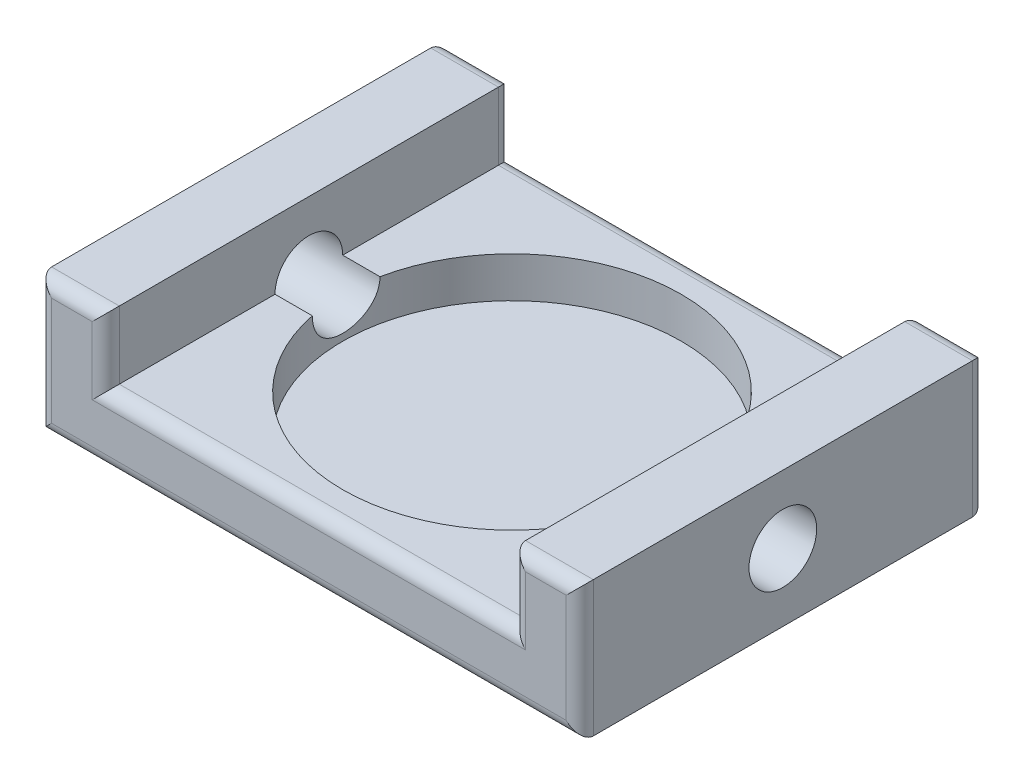
ISO-10303-21;
HEADER;
FILE_DESCRIPTION(('STEP AP214'),'2;1');
FILE_NAME('part.step','',(''),(''),'','','');
FILE_SCHEMA(('AUTOMOTIVE_DESIGN { 1 0 10303 214 1 1 1 1 }'));
ENDSEC;
DATA;
#1=APPLICATION_CONTEXT('core data for automotive mechanical design processes');
#2=APPLICATION_PROTOCOL_DEFINITION('international standard','automotive_design',2000,#1);
#3=PRODUCT_CONTEXT('',#1,'mechanical');
#4=PRODUCT('Part','Part','',(#3));
#5=PRODUCT_RELATED_PRODUCT_CATEGORY('part','',(#4));
#6=PRODUCT_DEFINITION_FORMATION('','',#4);
#7=PRODUCT_DEFINITION_CONTEXT('part definition',#1,'design');
#8=PRODUCT_DEFINITION('design','',#6,#7);
#9=PRODUCT_DEFINITION_SHAPE('','',#8);
#10=(LENGTH_UNIT() NAMED_UNIT(*) SI_UNIT(.MILLI.,.METRE.));
#11=(NAMED_UNIT(*) PLANE_ANGLE_UNIT() SI_UNIT($,.RADIAN.));
#12=(NAMED_UNIT(*) SI_UNIT($,.STERADIAN.) SOLID_ANGLE_UNIT());
#13=UNCERTAINTY_MEASURE_WITH_UNIT(LENGTH_MEASURE(1.E-05),#10,'distance_accuracy_value','');
#14=(GEOMETRIC_REPRESENTATION_CONTEXT(3) GLOBAL_UNCERTAINTY_ASSIGNED_CONTEXT((#13)) GLOBAL_UNIT_ASSIGNED_CONTEXT((#10,
#11,#12)) REPRESENTATION_CONTEXT('',''));
#15=CARTESIAN_POINT('',(0.,0.,0.));
#16=DIRECTION('',(0.,0.,1.));
#17=DIRECTION('',(1.,0.,0.));
#18=AXIS2_PLACEMENT_3D('',#15,#16,#17);
#19=CARTESIAN_POINT('',(40.,5.,-15.));
#20=DIRECTION('',(-1.,0.,0.));
#21=DIRECTION('',(0.,0.,1.));
#22=AXIS2_PLACEMENT_3D('',#19,#20,#21);
#23=CYLINDRICAL_SURFACE('',#22,2.5);
#24=CARTESIAN_POINT('',(0.,5.,-15.));
#25=DIRECTION('',(-1.,0.,0.));
#26=DIRECTION('',(0.,0.,1.));
#27=AXIS2_PLACEMENT_3D('',#24,#25,#26);
#28=CIRCLE('',#27,2.5);
#29=CARTESIAN_POINT('',(0.,5.,-12.5));
#30=VERTEX_POINT('',#29);
#31=EDGE_CURVE('E365',#30,#30,#28,.T.);
#32=ORIENTED_EDGE('',*,*,#31,.T.);
#33=EDGE_LOOP('',(#32));
#34=FACE_BOUND('',#33,.T.);
#35=DIRECTION('',(-1.,0.,0.));
#36=VECTOR('',#35,1.);
#37=CARTESIAN_POINT('',(40.,5.,-12.5));
#38=LINE('',#37,#36);
#39=CARTESIAN_POINT('',(7.75255128608412,5.,-12.5));
#40=VERTEX_POINT('',#39);
#41=CARTESIAN_POINT('',(5.,5.,-12.5));
#42=VERTEX_POINT('',#41);
#43=EDGE_CURVE('E199',#40,#42,#38,.T.);
#44=ORIENTED_EDGE('',*,*,#43,.F.);
#45=CARTESIAN_POINT('',(7.75255128608412,5.,-12.5));
#46=CARTESIAN_POINT('',(7.75255731295192,4.93043599285122,-12.4999924472726));
#47=CARTESIAN_POINT('',(7.75195874531872,4.86087615811526,-12.5029034044694));
#48=CARTESIAN_POINT('',(7.74959704713843,4.72226825002578,-12.5145037546515));
#49=CARTESIAN_POINT('',(7.74783406065433,4.65322011443287,-12.5231924328126));
#50=CARTESIAN_POINT('',(7.74319166095998,4.51622575334778,-12.5462721151779));
#51=CARTESIAN_POINT('',(7.74031394865905,4.44827801258642,-12.5606544324488));
#52=CARTESIAN_POINT('',(7.73353148594676,4.31387798941378,-12.5949939869294));
#53=CARTESIAN_POINT('',(7.72962673134275,4.24742571310859,-12.6149512468976));
#54=CARTESIAN_POINT('',(7.71653074955641,4.05099524532085,-12.6829872670659));
#55=CARTESIAN_POINT('',(7.70595386365234,3.92383495170288,-12.7392486829428));
#56=CARTESIAN_POINT('',(7.68230659339935,3.68081051437811,-12.8718702906674));
#57=CARTESIAN_POINT('',(7.66923595065316,3.56494754315514,-12.9482325656308));
#58=CARTESIAN_POINT('',(7.64186822947588,3.34610785170309,-13.1200472116145));
#59=CARTESIAN_POINT('',(7.62755780730428,3.24331128959749,-13.2157273393524));
#60=CARTESIAN_POINT('',(7.59943933013465,3.05511190630132,-13.4229739286767));
#61=CARTESIAN_POINT('',(7.58563135324545,2.96971178010718,-13.5345428471585));
#62=CARTESIAN_POINT('',(7.55992974731948,2.81802828917806,-13.7715997562859));
#63=CARTESIAN_POINT('',(7.54805382009446,2.75191772198595,-13.8972004085461));
#64=CARTESIAN_POINT('',(7.52770611149326,2.64181014363031,-14.1579970242398));
#65=CARTESIAN_POINT('',(7.51923382662374,2.59780986149927,-14.2931915649865));
#66=CARTESIAN_POINT('',(7.5067420561387,2.53373241693049,-14.5674564700269));
#67=CARTESIAN_POINT('',(7.50266543711247,2.51334803649467,-14.706452411483));
#68=CARTESIAN_POINT('',(7.49922695619612,2.49612254120034,-14.985950310204));
#69=CARTESIAN_POINT('',(7.49986474935861,2.49927970383803,-15.1264521565326));
#70=CARTESIAN_POINT('',(7.50573913894405,2.5288155036062,-15.4028555063468));
#71=CARTESIAN_POINT('',(7.51091007921787,2.55486262547944,-15.538794033247));
#72=CARTESIAN_POINT('',(7.52519563744545,2.62891294172258,-15.8043300165313));
#73=CARTESIAN_POINT('',(7.53431038436714,2.67691685411279,-15.9339272653924));
#74=CARTESIAN_POINT('',(7.55556777198974,2.79382600893242,-16.1840506782429));
#75=CARTESIAN_POINT('',(7.56772919022337,2.86286146736692,-16.3045143170306));
#76=CARTESIAN_POINT('',(7.59373870926992,3.01977567563967,-16.5322660947182));
#77=CARTESIAN_POINT('',(7.60758694982373,3.10765598709533,-16.6395531405533));
#78=CARTESIAN_POINT('',(7.6357240657876,3.30157090407736,-16.8398655163435));
#79=CARTESIAN_POINT('',(7.65001641895657,3.40789350518275,-16.9326117374893));
#80=CARTESIAN_POINT('',(7.67720734708936,3.63476189621838,-17.0990272497494));
#81=CARTESIAN_POINT('',(7.69010553536481,3.7553116129146,-17.172691256054));
#82=CARTESIAN_POINT('',(7.71305674894199,4.00763101236582,-17.2989498866117));
#83=CARTESIAN_POINT('',(7.72310201254138,4.13943005849171,-17.3514871915862));
#84=CARTESIAN_POINT('',(7.73909597343767,4.41014657813895,-17.4335177433248));
#85=CARTESIAN_POINT('',(7.74505077179283,4.54905311662029,-17.4630453187108));
#86=CARTESIAN_POINT('',(7.74992057020093,4.74089204211611,-17.4870823453049));
#87=CARTESIAN_POINT('',(7.75090600320019,4.79263534945611,-17.4919281391388));
#88=CARTESIAN_POINT('',(7.75222081533071,4.89624466034355,-17.4983829116616));
#89=CARTESIAN_POINT('',(7.75255129237939,4.94811031238945,-17.4999973072616));
#90=CARTESIAN_POINT('',(7.75255128608412,5.,-17.5));
#91=B_SPLINE_CURVE_WITH_KNOTS('',3,(#45,#46,#47,#48,#49,#50,#51,#52,#53,#54,#55,#56,#57,#58,#59,
#60,#61,#62,#63,#64,#65,#66,#67,#68,#69,#70,#71,#72,#73,#74,#75,#76,#77,#78,#79,#80,#81,#82,#83,
#84,#85,#86,#87,#88,#89,#90),.UNSPECIFIED.,.F.,.F.,(4,2,2,2,2,2,2,2,2,2,2,2,2,2,2,2,2,2,2,2,2,2,
4),(0.,0.208621275894802,0.417216745803838,0.62549517523698,0.833774454931105,1.25000691135225,
1.66628252025787,2.08778731527755,2.50935735880446,2.93459542557449,3.35977056463055,
3.77935021287091,4.19889916132035,4.61247011057754,5.02605458519858,5.44225366753897,
5.85848725240716,6.28192795775072,6.70548580970532,7.13018519486867,7.55424974394838,
7.71010621722896,7.86570120305829),.UNSPECIFIED.);
#92=CARTESIAN_POINT('',(7.75255128608412,5.,-17.5));
#93=VERTEX_POINT('',#92);
#94=EDGE_CURVE('E177',#40,#93,#91,.T.);
#95=ORIENTED_EDGE('',*,*,#94,.T.);
#96=DIRECTION('',(-1.,0.,0.));
#97=VECTOR('',#96,1.);
#98=CARTESIAN_POINT('',(40.,5.,-17.5));
#99=LINE('',#98,#97);
#100=CARTESIAN_POINT('',(5.,5.,-17.5));
#101=VERTEX_POINT('',#100);
#102=EDGE_CURVE('E182',#101,#93,#99,.F.);
#103=ORIENTED_EDGE('',*,*,#102,.F.);
#104=CARTESIAN_POINT('',(5.,5.,-15.));
#105=DIRECTION('',(-1.,0.,0.));
#106=DIRECTION('',(0.,0.,1.));
#107=AXIS2_PLACEMENT_3D('',#104,#105,#106);
#108=CIRCLE('',#107,2.5);
#109=EDGE_CURVE('E198',#101,#42,#108,.F.);
#110=ORIENTED_EDGE('',*,*,#109,.T.);
#111=EDGE_LOOP('',(#44,#95,#103,#110));
#112=FACE_BOUND('',#111,.T.);
#113=ADVANCED_FACE('F34',(#34,#112),#23,.F.);
#114=CARTESIAN_POINT('',(0.,10.,0.));
#115=DIRECTION('',(0.,1.,0.));
#116=DIRECTION('',(0.,0.,1.));
#117=AXIS2_PLACEMENT_3D('',#114,#115,#116);
#118=PLANE('',#117);
#119=DIRECTION('',(0.,0.,-1.));
#120=VECTOR('',#119,1.);
#121=CARTESIAN_POINT('',(35.,10.,0.));
#122=LINE('',#121,#120);
#123=CARTESIAN_POINT('',(35.,10.,-1.));
#124=VERTEX_POINT('',#123);
#125=CARTESIAN_POINT('',(35.,10.,-29.));
#126=VERTEX_POINT('',#125);
#127=EDGE_CURVE('E357',#124,#126,#122,.T.);
#128=ORIENTED_EDGE('',*,*,#127,.F.);
#129=DIRECTION('',(1.,0.,0.));
#130=VECTOR('',#129,1.);
#131=CARTESIAN_POINT('',(40.,10.,-1.));
#132=LINE('',#131,#130);
#133=CARTESIAN_POINT('',(40.,10.,-1.));
#134=VERTEX_POINT('',#133);
#135=EDGE_CURVE('E258',#124,#134,#132,.T.);
#136=ORIENTED_EDGE('',*,*,#135,.T.);
#137=DIRECTION('',(0.,0.,-1.));
#138=VECTOR('',#137,1.);
#139=CARTESIAN_POINT('',(40.,10.,0.));
#140=LINE('',#139,#138);
#141=CARTESIAN_POINT('',(40.,10.,-29.));
#142=VERTEX_POINT('',#141);
#143=EDGE_CURVE('E204',#134,#142,#140,.T.);
#144=ORIENTED_EDGE('',*,*,#143,.T.);
#145=DIRECTION('',(-1.,0.,0.));
#146=VECTOR('',#145,1.);
#147=CARTESIAN_POINT('',(35.,10.,-29.));
#148=LINE('',#147,#146);
#149=EDGE_CURVE('E256',#142,#126,#148,.T.);
#150=ORIENTED_EDGE('',*,*,#149,.T.);
#151=EDGE_LOOP('',(#128,#136,#144,#150));
#152=FACE_BOUND('',#151,.T.);
#153=ADVANCED_FACE('F411',(#152),#118,.T.);
#154=CARTESIAN_POINT('',(40.,5.,-15.));
#155=DIRECTION('',(-1.,0.,0.));
#156=DIRECTION('',(0.,0.,1.));
#157=AXIS2_PLACEMENT_3D('',#154,#155,#156);
#158=CIRCLE('',#157,2.5);
#159=CARTESIAN_POINT('',(40.,5.,-12.5));
#160=VERTEX_POINT('',#159);
#161=EDGE_CURVE('E370',#160,#160,#158,.T.);
#162=ORIENTED_EDGE('',*,*,#161,.F.);
#163=EDGE_LOOP('',(#162));
#164=FACE_BOUND('',#163,.T.);
#165=CARTESIAN_POINT('',(32.2474487139159,5.,-17.5));
#166=VERTEX_POINT('',#165);
#167=CARTESIAN_POINT('',(35.,5.,-17.5));
#168=VERTEX_POINT('',#167);
#169=EDGE_CURVE('E190',#166,#168,#99,.F.);
#170=ORIENTED_EDGE('',*,*,#169,.F.);
#171=CARTESIAN_POINT('',(32.2474487139159,5.,-17.5));
#172=CARTESIAN_POINT('',(32.2474426870481,4.93043599285122,-17.5000075527274));
#173=CARTESIAN_POINT('',(32.2480412546813,4.86087615811526,-17.4970965955306));
#174=CARTESIAN_POINT('',(32.2504029528616,4.72226825002578,-17.4854962453485));
#175=CARTESIAN_POINT('',(32.2521659393457,4.65322011443287,-17.4768075671874));
#176=CARTESIAN_POINT('',(32.25680833904,4.51622575334778,-17.4537278848221));
#177=CARTESIAN_POINT('',(32.259686051341,4.44827801258642,-17.4393455675512));
#178=CARTESIAN_POINT('',(32.2664685140532,4.31387798941378,-17.4050060130706));
#179=CARTESIAN_POINT('',(32.2703732686573,4.24742571310859,-17.3850487531024));
#180=CARTESIAN_POINT('',(32.2834692504436,4.05099524532085,-17.3170127329341));
#181=CARTESIAN_POINT('',(32.2940461363477,3.92383495170288,-17.2607513170572));
#182=CARTESIAN_POINT('',(32.3176934066007,3.68081051437811,-17.1281297093326));
#183=CARTESIAN_POINT('',(32.3307640493469,3.56494754315514,-17.0517674343692));
#184=CARTESIAN_POINT('',(32.3581317705241,3.34610785170309,-16.8799527883855));
#185=CARTESIAN_POINT('',(32.3724421926957,3.24331128959749,-16.7842726606476));
#186=CARTESIAN_POINT('',(32.4005606698654,3.05511190630132,-16.5770260713233));
#187=CARTESIAN_POINT('',(32.4143686467546,2.96971178010718,-16.4654571528415));
#188=CARTESIAN_POINT('',(32.4400702526805,2.81802828917806,-16.2284002437141));
#189=CARTESIAN_POINT('',(32.4519461799055,2.75191772198595,-16.1027995914539));
#190=CARTESIAN_POINT('',(32.4722938885068,2.64181014363031,-15.8420029757602));
#191=CARTESIAN_POINT('',(32.4807661733763,2.59780986149928,-15.7068084350135));
#192=CARTESIAN_POINT('',(32.4932579438613,2.53373241693049,-15.4325435299731));
#193=CARTESIAN_POINT('',(32.4973345628875,2.51334803649467,-15.293547588517));
#194=CARTESIAN_POINT('',(32.5007730438039,2.49612254120034,-15.014049689796));
#195=CARTESIAN_POINT('',(32.5001352506414,2.49927970383803,-14.8735478434674));
#196=CARTESIAN_POINT('',(32.494260861056,2.5288155036062,-14.5971444936532));
#197=CARTESIAN_POINT('',(32.4890899207821,2.55486262547944,-14.461205966753));
#198=CARTESIAN_POINT('',(32.4748043625546,2.62891294172258,-14.1956699834687));
#199=CARTESIAN_POINT('',(32.4656896156329,2.67691685411279,-14.0660727346076));
#200=CARTESIAN_POINT('',(32.4444322280103,2.79382600893242,-13.8159493217571));
#201=CARTESIAN_POINT('',(32.4322708097766,2.86286146736692,-13.6954856829694));
#202=CARTESIAN_POINT('',(32.4062612907301,3.01977567563967,-13.4677339052818));
#203=CARTESIAN_POINT('',(32.3924130501763,3.10765598709533,-13.3604468594467));
#204=CARTESIAN_POINT('',(32.3642759342124,3.30157090407735,-13.1601344836565));
#205=CARTESIAN_POINT('',(32.3499835810434,3.40789350518275,-13.0673882625107));
#206=CARTESIAN_POINT('',(32.3227926529106,3.63476189621838,-12.9009727502506));
#207=CARTESIAN_POINT('',(32.3098944646352,3.7553116129146,-12.827308743946));
#208=CARTESIAN_POINT('',(32.286943251058,4.00763101236582,-12.7010501133883));
#209=CARTESIAN_POINT('',(32.2768979874586,4.13943005849171,-12.6485128084138));
#210=CARTESIAN_POINT('',(32.2609040265623,4.41014657813895,-12.5664822566752));
#211=CARTESIAN_POINT('',(32.2549492282072,4.54905311662029,-12.5369546812892));
#212=CARTESIAN_POINT('',(32.2500794297991,4.74089204211611,-12.5129176546951));
#213=CARTESIAN_POINT('',(32.2490939967998,4.79263534945611,-12.5080718608612));
#214=CARTESIAN_POINT('',(32.2477791846693,4.89624466034355,-12.5016170883384));
#215=CARTESIAN_POINT('',(32.2474487076206,4.94811031238945,-12.5000026927384));
#216=CARTESIAN_POINT('',(32.2474487139159,5.,-12.5));
#217=B_SPLINE_CURVE_WITH_KNOTS('',3,(#171,#172,#173,#174,#175,#176,#177,#178,#179,#180,#181,
#182,#183,#184,#185,#186,#187,#188,#189,#190,#191,#192,#193,#194,#195,#196,#197,#198,#199,#200,
#201,#202,#203,#204,#205,#206,#207,#208,#209,#210,#211,#212,#213,#214,#215,#216),.UNSPECIFIED.,
.F.,.F.,(4,2,2,2,2,2,2,2,2,2,2,2,2,2,2,2,2,2,2,2,2,2,4),(0.,0.208621275894802,0.417216745803838,
0.62549517523698,0.833774454931105,1.25000691135225,1.66628252025787,2.08778731527756,
2.50935735880446,2.93459542557449,3.35977056463055,3.77935021287091,4.19889916132035,
4.61247011057754,5.02605458519858,5.44225366753897,5.85848725240716,6.28192795775072,
6.70548580970531,7.13018519486867,7.55424974394838,7.71010621722896,7.86570120305829),.UNSPECIFIED.);
#218=CARTESIAN_POINT('',(32.2474487139159,5.,-12.5));
#219=VERTEX_POINT('',#218);
#220=EDGE_CURVE('E174',#166,#219,#217,.T.);
#221=ORIENTED_EDGE('',*,*,#220,.T.);
#222=CARTESIAN_POINT('',(35.,5.,-12.5));
#223=VERTEX_POINT('',#222);
#224=EDGE_CURVE('E189',#223,#219,#38,.T.);
#225=ORIENTED_EDGE('',*,*,#224,.F.);
#226=CARTESIAN_POINT('',(35.,5.,-15.));
#227=DIRECTION('',(1.,0.,0.));
#228=DIRECTION('',(0.,0.,-1.));
#229=AXIS2_PLACEMENT_3D('',#226,#227,#228);
#230=CIRCLE('',#229,2.5);
#231=EDGE_CURVE('E202',#223,#168,#230,.F.);
#232=ORIENTED_EDGE('',*,*,#231,.T.);
#233=EDGE_LOOP('',(#170,#221,#225,#232));
#234=FACE_BOUND('',#233,.T.);
#235=ADVANCED_FACE('F187',(#164,#234),#23,.F.);
#236=CARTESIAN_POINT('',(0.,10.,-30.));
#237=DIRECTION('',(1.,0.,0.));
#238=DIRECTION('',(0.,0.,-1.));
#239=AXIS2_PLACEMENT_3D('',#236,#237,#238);
#240=PLANE('',#239);
#241=ORIENTED_EDGE('',*,*,#31,.F.);
#242=EDGE_LOOP('',(#241));
#243=FACE_BOUND('',#242,.T.);
#244=DIRECTION('',(0.,0.,1.));
#245=VECTOR('',#244,1.);
#246=CARTESIAN_POINT('',(0.,0.,-30.));
#247=LINE('',#246,#245);
#248=CARTESIAN_POINT('',(0.,0.,-29.));
#249=VERTEX_POINT('',#248);
#250=CARTESIAN_POINT('',(0.,0.,-1.));
#251=VERTEX_POINT('',#250);
#252=EDGE_CURVE('E373',#249,#251,#247,.T.);
#253=ORIENTED_EDGE('',*,*,#252,.T.);
#254=DIRECTION('',(0.,-1.,0.));
#255=VECTOR('',#254,1.);
#256=CARTESIAN_POINT('',(0.,10.,-1.));
#257=LINE('',#256,#255);
#258=CARTESIAN_POINT('',(0.,10.,-1.));
#259=VERTEX_POINT('',#258);
#260=EDGE_CURVE('E239',#251,#259,#257,.F.);
#261=ORIENTED_EDGE('',*,*,#260,.T.);
#262=DIRECTION('',(0.,0.,1.));
#263=VECTOR('',#262,1.);
#264=CARTESIAN_POINT('',(0.,10.,-30.));
#265=LINE('',#264,#263);
#266=CARTESIAN_POINT('',(0.,10.,-29.));
#267=VERTEX_POINT('',#266);
#268=EDGE_CURVE('E376',#267,#259,#265,.T.);
#269=ORIENTED_EDGE('',*,*,#268,.F.);
#270=DIRECTION('',(0.,-1.,0.));
#271=VECTOR('',#270,1.);
#272=CARTESIAN_POINT('',(0.,10.,-29.));
#273=LINE('',#272,#271);
#274=EDGE_CURVE('E237',#267,#249,#273,.T.);
#275=ORIENTED_EDGE('',*,*,#274,.T.);
#276=EDGE_LOOP('',(#253,#261,#269,#275));
#277=FACE_BOUND('',#276,.T.);
#278=ADVANCED_FACE('F423',(#243,#277),#240,.F.);
#279=CARTESIAN_POINT('',(0.,10.,0.));
#280=DIRECTION('',(0.,0.,-1.));
#281=DIRECTION('',(-1.,0.,0.));
#282=AXIS2_PLACEMENT_3D('',#279,#280,#281);
#283=PLANE('',#282);
#284=DIRECTION('',(1.,0.,0.));
#285=VECTOR('',#284,1.);
#286=CARTESIAN_POINT('',(0.,0.999999999999999,0.));
#287=LINE('',#286,#285);
#288=CARTESIAN_POINT('',(1.,0.999999999999999,0.));
#289=VERTEX_POINT('',#288);
#290=CARTESIAN_POINT('',(39.,0.999999999999999,0.));
#291=VERTEX_POINT('',#290);
#292=EDGE_CURVE('E228',#289,#291,#287,.T.);
#293=ORIENTED_EDGE('',*,*,#292,.T.);
#294=DIRECTION('',(0.,-1.,0.));
#295=VECTOR('',#294,1.);
#296=CARTESIAN_POINT('',(39.,10.,0.));
#297=LINE('',#296,#295);
#298=CARTESIAN_POINT('',(39.,9.,0.));
#299=VERTEX_POINT('',#298);
#300=EDGE_CURVE('E230',#291,#299,#297,.F.);
#301=ORIENTED_EDGE('',*,*,#300,.T.);
#302=DIRECTION('',(1.,0.,0.));
#303=VECTOR('',#302,1.);
#304=CARTESIAN_POINT('',(35.,9.,0.));
#305=LINE('',#304,#303);
#306=CARTESIAN_POINT('',(36.,9.,0.));
#307=VERTEX_POINT('',#306);
#308=EDGE_CURVE('E216',#299,#307,#305,.F.);
#309=ORIENTED_EDGE('',*,*,#308,.T.);
#310=DIRECTION('',(0.,1.,0.));
#311=VECTOR('',#310,1.);
#312=CARTESIAN_POINT('',(36.,10.,0.));
#313=LINE('',#312,#311);
#314=CARTESIAN_POINT('',(36.,4.,0.));
#315=VERTEX_POINT('',#314);
#316=EDGE_CURVE('E218',#307,#315,#313,.F.);
#317=ORIENTED_EDGE('',*,*,#316,.T.);
#318=DIRECTION('',(1.,0.,0.));
#319=VECTOR('',#318,1.);
#320=CARTESIAN_POINT('',(5.,4.,0.));
#321=LINE('',#320,#319);
#322=CARTESIAN_POINT('',(4.,4.,0.));
#323=VERTEX_POINT('',#322);
#324=EDGE_CURVE('E220',#315,#323,#321,.F.);
#325=ORIENTED_EDGE('',*,*,#324,.T.);
#326=DIRECTION('',(0.,1.,0.));
#327=VECTOR('',#326,1.);
#328=CARTESIAN_POINT('',(4.,10.,0.));
#329=LINE('',#328,#327);
#330=CARTESIAN_POINT('',(4.,9.,0.));
#331=VERTEX_POINT('',#330);
#332=EDGE_CURVE('E222',#323,#331,#329,.T.);
#333=ORIENTED_EDGE('',*,*,#332,.T.);
#334=DIRECTION('',(1.,0.,0.));
#335=VECTOR('',#334,1.);
#336=CARTESIAN_POINT('',(0.,9.,0.));
#337=LINE('',#336,#335);
#338=CARTESIAN_POINT('',(1.,9.,0.));
#339=VERTEX_POINT('',#338);
#340=EDGE_CURVE('E224',#331,#339,#337,.F.);
#341=ORIENTED_EDGE('',*,*,#340,.T.);
#342=DIRECTION('',(0.,-1.,0.));
#343=VECTOR('',#342,1.);
#344=CARTESIAN_POINT('',(1.,10.,0.));
#345=LINE('',#344,#343);
#346=EDGE_CURVE('E226',#339,#289,#345,.T.);
#347=ORIENTED_EDGE('',*,*,#346,.T.);
#348=EDGE_LOOP('',(#293,#301,#309,#317,#325,#333,#341,#347));
#349=FACE_BOUND('',#348,.T.);
#350=ADVANCED_FACE('F428',(#349),#283,.F.);
#351=CARTESIAN_POINT('',(40.,10.,0.));
#352=DIRECTION('',(-1.,0.,0.));
#353=DIRECTION('',(0.,0.,1.));
#354=AXIS2_PLACEMENT_3D('',#351,#352,#353);
#355=PLANE('',#354);
#356=ORIENTED_EDGE('',*,*,#161,.T.);
#357=EDGE_LOOP('',(#356));
#358=FACE_BOUND('',#357,.T.);
#359=ORIENTED_EDGE('',*,*,#143,.F.);
#360=DIRECTION('',(0.,-1.,0.));
#361=VECTOR('',#360,1.);
#362=CARTESIAN_POINT('',(40.,10.,-1.));
#363=LINE('',#362,#361);
#364=CARTESIAN_POINT('',(40.,0.,-1.));
#365=VERTEX_POINT('',#364);
#366=EDGE_CURVE('E213',#134,#365,#363,.T.);
#367=ORIENTED_EDGE('',*,*,#366,.T.);
#368=DIRECTION('',(0.,0.,-1.));
#369=VECTOR('',#368,1.);
#370=CARTESIAN_POINT('',(40.,0.,0.));
#371=LINE('',#370,#369);
#372=CARTESIAN_POINT('',(40.,0.,-29.));
#373=VERTEX_POINT('',#372);
#374=EDGE_CURVE('E206',#365,#373,#371,.T.);
#375=ORIENTED_EDGE('',*,*,#374,.T.);
#376=DIRECTION('',(0.,-1.,0.));
#377=VECTOR('',#376,1.);
#378=CARTESIAN_POINT('',(40.,10.,-29.));
#379=LINE('',#378,#377);
#380=EDGE_CURVE('E181',#373,#142,#379,.F.);
#381=ORIENTED_EDGE('',*,*,#380,.T.);
#382=EDGE_LOOP('',(#359,#367,#375,#381));
#383=FACE_BOUND('',#382,.T.);
#384=ADVANCED_FACE('F388',(#358,#383),#355,.F.);
#385=CARTESIAN_POINT('',(40.,10.,-30.));
#386=DIRECTION('',(0.,0.,1.));
#387=DIRECTION('',(1.,0.,0.));
#388=AXIS2_PLACEMENT_3D('',#385,#386,#387);
#389=PLANE('',#388);
#390=DIRECTION('',(-1.,0.,0.));
#391=VECTOR('',#390,1.);
#392=CARTESIAN_POINT('',(5.,9.,-30.));
#393=LINE('',#392,#391);
#394=CARTESIAN_POINT('',(1.,9.,-30.));
#395=VERTEX_POINT('',#394);
#396=CARTESIAN_POINT('',(4.,9.,-30.));
#397=VERTEX_POINT('',#396);
#398=EDGE_CURVE('E51',#395,#397,#393,.F.);
#399=ORIENTED_EDGE('',*,*,#398,.T.);
#400=DIRECTION('',(0.,1.,0.));
#401=VECTOR('',#400,1.);
#402=CARTESIAN_POINT('',(4.,10.,-30.));
#403=LINE('',#402,#401);
#404=CARTESIAN_POINT('',(4.,4.,-30.));
#405=VERTEX_POINT('',#404);
#406=EDGE_CURVE('E43',#397,#405,#403,.F.);
#407=ORIENTED_EDGE('',*,*,#406,.T.);
#408=DIRECTION('',(-1.,0.,0.));
#409=VECTOR('',#408,1.);
#410=CARTESIAN_POINT('',(35.,4.,-30.));
#411=LINE('',#410,#409);
#412=CARTESIAN_POINT('',(36.,4.,-30.));
#413=VERTEX_POINT('',#412);
#414=EDGE_CURVE('E260',#405,#413,#411,.F.);
#415=ORIENTED_EDGE('',*,*,#414,.T.);
#416=DIRECTION('',(0.,1.,0.));
#417=VECTOR('',#416,1.);
#418=CARTESIAN_POINT('',(36.,10.,-30.));
#419=LINE('',#418,#417);
#420=CARTESIAN_POINT('',(36.,9.,-30.));
#421=VERTEX_POINT('',#420);
#422=EDGE_CURVE('E262',#413,#421,#419,.T.);
#423=ORIENTED_EDGE('',*,*,#422,.T.);
#424=DIRECTION('',(-1.,0.,0.));
#425=VECTOR('',#424,1.);
#426=CARTESIAN_POINT('',(40.,9.,-30.));
#427=LINE('',#426,#425);
#428=CARTESIAN_POINT('',(39.,9.,-30.));
#429=VERTEX_POINT('',#428);
#430=EDGE_CURVE('E264',#421,#429,#427,.F.);
#431=ORIENTED_EDGE('',*,*,#430,.T.);
#432=DIRECTION('',(0.,-1.,0.));
#433=VECTOR('',#432,1.);
#434=CARTESIAN_POINT('',(39.,10.,-30.));
#435=LINE('',#434,#433);
#436=CARTESIAN_POINT('',(39.,0.999999999999999,-30.));
#437=VERTEX_POINT('',#436);
#438=EDGE_CURVE('E266',#429,#437,#435,.T.);
#439=ORIENTED_EDGE('',*,*,#438,.T.);
#440=DIRECTION('',(-1.,0.,0.));
#441=VECTOR('',#440,1.);
#442=CARTESIAN_POINT('',(40.,0.999999999999999,-30.));
#443=LINE('',#442,#441);
#444=CARTESIAN_POINT('',(1.,0.999999999999999,-30.));
#445=VERTEX_POINT('',#444);
#446=EDGE_CURVE('E268',#437,#445,#443,.T.);
#447=ORIENTED_EDGE('',*,*,#446,.T.);
#448=DIRECTION('',(0.,-1.,0.));
#449=VECTOR('',#448,1.);
#450=CARTESIAN_POINT('',(1.,10.,-30.));
#451=LINE('',#450,#449);
#452=EDGE_CURVE('E56',#445,#395,#451,.F.);
#453=ORIENTED_EDGE('',*,*,#452,.T.);
#454=EDGE_LOOP('',(#399,#407,#415,#423,#431,#439,#447,#453));
#455=FACE_BOUND('',#454,.T.);
#456=ADVANCED_FACE('F327',(#455),#389,.F.);
#457=ORIENTED_EDGE('',*,*,#268,.T.);
#458=DIRECTION('',(1.,0.,0.));
#459=VECTOR('',#458,1.);
#460=CARTESIAN_POINT('',(5.,10.,-1.));
#461=LINE('',#460,#459);
#462=CARTESIAN_POINT('',(5.,10.,-1.));
#463=VERTEX_POINT('',#462);
#464=EDGE_CURVE('E243',#259,#463,#461,.T.);
#465=ORIENTED_EDGE('',*,*,#464,.T.);
#466=DIRECTION('',(0.,0.,1.));
#467=VECTOR('',#466,1.);
#468=CARTESIAN_POINT('',(5.,10.,-30.));
#469=LINE('',#468,#467);
#470=CARTESIAN_POINT('',(5.,10.,-29.));
#471=VERTEX_POINT('',#470);
#472=EDGE_CURVE('E366',#471,#463,#469,.T.);
#473=ORIENTED_EDGE('',*,*,#472,.F.);
#474=DIRECTION('',(-1.,0.,0.));
#475=VECTOR('',#474,1.);
#476=CARTESIAN_POINT('',(0.,10.,-29.));
#477=LINE('',#476,#475);
#478=EDGE_CURVE('E241',#471,#267,#477,.T.);
#479=ORIENTED_EDGE('',*,*,#478,.T.);
#480=EDGE_LOOP('',(#457,#465,#473,#479));
#481=FACE_BOUND('',#480,.T.);
#482=ADVANCED_FACE('F418',(#481),#118,.T.);
#483=CARTESIAN_POINT('',(0.,0.,0.));
#484=DIRECTION('',(0.,1.,0.));
#485=DIRECTION('',(0.,0.,1.));
#486=AXIS2_PLACEMENT_3D('',#483,#484,#485);
#487=PLANE('',#486);
#488=ORIENTED_EDGE('',*,*,#374,.F.);
#489=DIRECTION('',(1.,0.,0.));
#490=VECTOR('',#489,1.);
#491=CARTESIAN_POINT('',(0.,0.,-1.));
#492=LINE('',#491,#490);
#493=EDGE_CURVE('E235',#365,#251,#492,.F.);
#494=ORIENTED_EDGE('',*,*,#493,.T.);
#495=ORIENTED_EDGE('',*,*,#252,.F.);
#496=DIRECTION('',(-1.,0.,0.));
#497=VECTOR('',#496,1.);
#498=CARTESIAN_POINT('',(0.,0.,-29.));
#499=LINE('',#498,#497);
#500=EDGE_CURVE('E233',#249,#373,#499,.F.);
#501=ORIENTED_EDGE('',*,*,#500,.T.);
#502=EDGE_LOOP('',(#488,#494,#495,#501));
#503=FACE_BOUND('',#502,.T.);
#504=ADVANCED_FACE('F391',(#503),#487,.F.);
#505=CARTESIAN_POINT('',(35.,5.,0.));
#506=DIRECTION('',(1.,0.,0.));
#507=DIRECTION('',(0.,0.,-1.));
#508=AXIS2_PLACEMENT_3D('',#505,#506,#507);
#509=PLANE('',#508);
#510=DIRECTION('',(0.,0.,-1.));
#511=VECTOR('',#510,1.);
#512=CARTESIAN_POINT('',(35.,5.,0.));
#513=LINE('',#512,#511);
#514=CARTESIAN_POINT('',(35.,5.,-1.));
#515=VERTEX_POINT('',#514);
#516=EDGE_CURVE('E196',#515,#223,#513,.T.);
#517=ORIENTED_EDGE('',*,*,#516,.F.);
#518=DIRECTION('',(0.,1.,0.));
#519=VECTOR('',#518,1.);
#520=CARTESIAN_POINT('',(35.,5.,-1.));
#521=LINE('',#520,#519);
#522=EDGE_CURVE('E254',#515,#124,#521,.T.);
#523=ORIENTED_EDGE('',*,*,#522,.T.);
#524=ORIENTED_EDGE('',*,*,#127,.T.);
#525=DIRECTION('',(0.,1.,0.));
#526=VECTOR('',#525,1.);
#527=CARTESIAN_POINT('',(35.,5.,-29.));
#528=LINE('',#527,#526);
#529=CARTESIAN_POINT('',(35.,5.,-29.));
#530=VERTEX_POINT('',#529);
#531=EDGE_CURVE('E252',#126,#530,#528,.F.);
#532=ORIENTED_EDGE('',*,*,#531,.T.);
#533=EDGE_CURVE('E347',#168,#530,#513,.T.);
#534=ORIENTED_EDGE('',*,*,#533,.F.);
#535=ORIENTED_EDGE('',*,*,#231,.F.);
#536=EDGE_LOOP('',(#517,#523,#524,#532,#534,#535));
#537=FACE_BOUND('',#536,.T.);
#538=ADVANCED_FACE('F498',(#537),#509,.F.);
#539=CARTESIAN_POINT('',(5.,5.,-30.));
#540=DIRECTION('',(-1.,0.,0.));
#541=DIRECTION('',(0.,0.,1.));
#542=AXIS2_PLACEMENT_3D('',#539,#540,#541);
#543=PLANE('',#542);
#544=ORIENTED_EDGE('',*,*,#472,.T.);
#545=DIRECTION('',(0.,1.,0.));
#546=VECTOR('',#545,1.);
#547=CARTESIAN_POINT('',(5.,5.,-1.));
#548=LINE('',#547,#546);
#549=CARTESIAN_POINT('',(5.,5.,-1.));
#550=VERTEX_POINT('',#549);
#551=EDGE_CURVE('E248',#463,#550,#548,.F.);
#552=ORIENTED_EDGE('',*,*,#551,.T.);
#553=DIRECTION('',(0.,0.,1.));
#554=VECTOR('',#553,1.);
#555=CARTESIAN_POINT('',(5.,5.,-30.));
#556=LINE('',#555,#554);
#557=EDGE_CURVE('E354',#42,#550,#556,.T.);
#558=ORIENTED_EDGE('',*,*,#557,.F.);
#559=ORIENTED_EDGE('',*,*,#109,.F.);
#560=CARTESIAN_POINT('',(5.,5.,-29.));
#561=VERTEX_POINT('',#560);
#562=EDGE_CURVE('E344',#561,#101,#556,.T.);
#563=ORIENTED_EDGE('',*,*,#562,.F.);
#564=DIRECTION('',(0.,1.,0.));
#565=VECTOR('',#564,1.);
#566=CARTESIAN_POINT('',(5.,5.,-29.));
#567=LINE('',#566,#565);
#568=EDGE_CURVE('E245',#561,#471,#567,.T.);
#569=ORIENTED_EDGE('',*,*,#568,.T.);
#570=EDGE_LOOP('',(#544,#552,#558,#559,#563,#569));
#571=FACE_BOUND('',#570,.T.);
#572=ADVANCED_FACE('F350',(#571),#543,.F.);
#573=CARTESIAN_POINT('',(0.,5.,0.));
#574=DIRECTION('',(0.,1.,0.));
#575=DIRECTION('',(0.,0.,1.));
#576=AXIS2_PLACEMENT_3D('',#573,#574,#575);
#577=PLANE('',#576);
#578=ORIENTED_EDGE('',*,*,#533,.T.);
#579=DIRECTION('',(-1.,0.,0.));
#580=VECTOR('',#579,1.);
#581=CARTESIAN_POINT('',(5.,5.,-29.));
#582=LINE('',#581,#580);
#583=EDGE_CURVE('E11',#530,#561,#582,.T.);
#584=ORIENTED_EDGE('',*,*,#583,.T.);
#585=ORIENTED_EDGE('',*,*,#562,.T.);
#586=ORIENTED_EDGE('',*,*,#102,.T.);
#587=CARTESIAN_POINT('',(20.,5.,-15.));
#588=DIRECTION('',(0.,1.,0.));
#589=DIRECTION('',(0.,0.,1.));
#590=AXIS2_PLACEMENT_3D('',#587,#588,#589);
#591=CIRCLE('',#590,12.5);
#592=EDGE_CURVE('E295',#166,#93,#591,.T.);
#593=ORIENTED_EDGE('',*,*,#592,.F.);
#594=ORIENTED_EDGE('',*,*,#169,.T.);
#595=EDGE_LOOP('',(#578,#584,#585,#586,#593,#594));
#596=FACE_BOUND('',#595,.T.);
#597=ADVANCED_FACE('F343',(#596),#577,.T.);
#598=ORIENTED_EDGE('',*,*,#557,.T.);
#599=DIRECTION('',(1.,0.,0.));
#600=VECTOR('',#599,1.);
#601=CARTESIAN_POINT('',(35.,5.,-1.));
#602=LINE('',#601,#600);
#603=EDGE_CURVE('E250',#550,#515,#602,.T.);
#604=ORIENTED_EDGE('',*,*,#603,.T.);
#605=ORIENTED_EDGE('',*,*,#516,.T.);
#606=ORIENTED_EDGE('',*,*,#224,.T.);
#607=CARTESIAN_POINT('',(20.,5.,-15.));
#608=DIRECTION('',(0.,1.,0.));
#609=DIRECTION('',(0.,0.,1.));
#610=AXIS2_PLACEMENT_3D('',#607,#608,#609);
#611=CIRCLE('',#610,12.5);
#612=EDGE_CURVE('E171',#40,#219,#611,.T.);
#613=ORIENTED_EDGE('',*,*,#612,.F.);
#614=ORIENTED_EDGE('',*,*,#43,.T.);
#615=EDGE_LOOP('',(#598,#604,#605,#606,#613,#614));
#616=FACE_BOUND('',#615,.T.);
#617=ADVANCED_FACE('F194',(#616),#577,.T.);
#618=CARTESIAN_POINT('',(20.,2.,-15.));
#619=DIRECTION('',(0.,1.,0.));
#620=DIRECTION('',(0.,0.,1.));
#621=AXIS2_PLACEMENT_3D('',#618,#619,#620);
#622=CYLINDRICAL_SURFACE('',#621,12.5);
#623=CARTESIAN_POINT('',(20.,2.,-15.));
#624=DIRECTION('',(0.,1.,0.));
#625=DIRECTION('',(0.,0.,1.));
#626=AXIS2_PLACEMENT_3D('',#623,#624,#625);
#627=CIRCLE('',#626,12.5);
#628=CARTESIAN_POINT('',(20.,2.,-2.5));
#629=VERTEX_POINT('',#628);
#630=EDGE_CURVE('E191',#629,#629,#627,.T.);
#631=ORIENTED_EDGE('',*,*,#630,.F.);
#632=EDGE_LOOP('',(#631));
#633=FACE_BOUND('',#632,.T.);
#634=ORIENTED_EDGE('',*,*,#612,.T.);
#635=ORIENTED_EDGE('',*,*,#220,.F.);
#636=ORIENTED_EDGE('',*,*,#592,.T.);
#637=ORIENTED_EDGE('',*,*,#94,.F.);
#638=EDGE_LOOP('',(#634,#635,#636,#637));
#639=FACE_BOUND('',#638,.T.);
#640=ADVANCED_FACE('F173',(#633,#639),#622,.F.);
#641=CARTESIAN_POINT('',(20.,2.,-15.));
#642=DIRECTION('',(0.,1.,0.));
#643=DIRECTION('',(0.,0.,1.));
#644=AXIS2_PLACEMENT_3D('',#641,#642,#643);
#645=PLANE('',#644);
#646=ORIENTED_EDGE('',*,*,#630,.T.);
#647=EDGE_LOOP('',(#646));
#648=FACE_BOUND('',#647,.T.);
#649=ADVANCED_FACE('F473',(#648),#645,.T.);
#650=CARTESIAN_POINT('',(4.,10.,-1.));
#651=DIRECTION('',(0.,1.,0.));
#652=DIRECTION('',(0.,0.,1.));
#653=AXIS2_PLACEMENT_3D('',#650,#651,#652);
#654=CYLINDRICAL_SURFACE('',#653,1.);
#655=CARTESIAN_POINT('',(4.,9.,-1.));
#656=DIRECTION('',(-0.707106781186547,0.707106781186547,0.));
#657=DIRECTION('',(0.707106781186547,0.707106781186547,0.));
#658=AXIS2_PLACEMENT_3D('',#655,#656,#657);
#659=ELLIPSE('',#658,1.41421356237309,1.);
#660=EDGE_CURVE('E289',#331,#463,#659,.T.);
#661=ORIENTED_EDGE('',*,*,#660,.F.);
#662=ORIENTED_EDGE('',*,*,#332,.F.);
#663=CARTESIAN_POINT('',(4.,4.,-1.));
#664=DIRECTION('',(-0.707106781186547,0.707106781186547,0.));
#665=DIRECTION('',(0.707106781186547,0.707106781186547,0.));
#666=AXIS2_PLACEMENT_3D('',#663,#664,#665);
#667=ELLIPSE('',#666,1.41421356237309,1.);
#668=EDGE_CURVE('E292',#550,#323,#667,.F.);
#669=ORIENTED_EDGE('',*,*,#668,.F.);
#670=ORIENTED_EDGE('',*,*,#551,.F.);
#671=EDGE_LOOP('',(#661,#662,#669,#670));
#672=FACE_BOUND('',#671,.T.);
#673=ADVANCED_FACE('F470',(#672),#654,.T.);
#674=CARTESIAN_POINT('',(0.,4.,-1.));
#675=DIRECTION('',(-1.,0.,0.));
#676=DIRECTION('',(0.,0.,1.));
#677=AXIS2_PLACEMENT_3D('',#674,#675,#676);
#678=CYLINDRICAL_SURFACE('',#677,1.);
#679=ORIENTED_EDGE('',*,*,#668,.T.);
#680=ORIENTED_EDGE('',*,*,#324,.F.);
#681=CARTESIAN_POINT('',(36.,4.,-1.));
#682=DIRECTION('',(-0.707106781186547,-0.707106781186547,0.));
#683=DIRECTION('',(-0.707106781186547,0.707106781186547,0.));
#684=AXIS2_PLACEMENT_3D('',#681,#682,#683);
#685=ELLIPSE('',#684,1.41421356237309,1.);
#686=EDGE_CURVE('E286',#515,#315,#685,.F.);
#687=ORIENTED_EDGE('',*,*,#686,.F.);
#688=ORIENTED_EDGE('',*,*,#603,.F.);
#689=EDGE_LOOP('',(#679,#680,#687,#688));
#690=FACE_BOUND('',#689,.T.);
#691=ADVANCED_FACE('F467',(#690),#678,.T.);
#692=CARTESIAN_POINT('',(0.,9.,-1.));
#693=DIRECTION('',(-1.,0.,0.));
#694=DIRECTION('',(0.,0.,1.));
#695=AXIS2_PLACEMENT_3D('',#692,#693,#694);
#696=CYLINDRICAL_SURFACE('',#695,1.);
#697=ORIENTED_EDGE('',*,*,#660,.T.);
#698=ORIENTED_EDGE('',*,*,#464,.F.);
#699=CARTESIAN_POINT('',(1.,9.,-1.));
#700=DIRECTION('',(-0.707106781186547,-0.707106781186547,0.));
#701=DIRECTION('',(-0.707106781186547,0.707106781186547,0.));
#702=AXIS2_PLACEMENT_3D('',#699,#700,#701);
#703=ELLIPSE('',#702,1.41421356237309,1.);
#704=EDGE_CURVE('E283',#339,#259,#703,.T.);
#705=ORIENTED_EDGE('',*,*,#704,.F.);
#706=ORIENTED_EDGE('',*,*,#340,.F.);
#707=EDGE_LOOP('',(#697,#698,#705,#706));
#708=FACE_BOUND('',#707,.T.);
#709=ADVANCED_FACE('F463',(#708),#696,.T.);
#710=CARTESIAN_POINT('',(36.,5.,-1.));
#711=DIRECTION('',(0.,1.,0.));
#712=DIRECTION('',(0.,0.,1.));
#713=AXIS2_PLACEMENT_3D('',#710,#711,#712);
#714=CYLINDRICAL_SURFACE('',#713,1.);
#715=ORIENTED_EDGE('',*,*,#686,.T.);
#716=ORIENTED_EDGE('',*,*,#316,.F.);
#717=CARTESIAN_POINT('',(36.,9.,-1.));
#718=DIRECTION('',(-0.707106781186547,-0.707106781186547,0.));
#719=DIRECTION('',(-0.707106781186547,0.707106781186547,0.));
#720=AXIS2_PLACEMENT_3D('',#717,#718,#719);
#721=ELLIPSE('',#720,1.41421356237309,1.);
#722=EDGE_CURVE('E280',#124,#307,#721,.F.);
#723=ORIENTED_EDGE('',*,*,#722,.F.);
#724=ORIENTED_EDGE('',*,*,#522,.F.);
#725=EDGE_LOOP('',(#715,#716,#723,#724));
#726=FACE_BOUND('',#725,.T.);
#727=ADVANCED_FACE('F459',(#726),#714,.T.);
#728=CARTESIAN_POINT('',(1.,10.,-1.));
#729=DIRECTION('',(0.,-1.,0.));
#730=DIRECTION('',(0.,0.,-1.));
#731=AXIS2_PLACEMENT_3D('',#728,#729,#730);
#732=CYLINDRICAL_SURFACE('',#731,1.);
#733=ORIENTED_EDGE('',*,*,#704,.T.);
#734=ORIENTED_EDGE('',*,*,#260,.F.);
#735=CARTESIAN_POINT('',(1.,0.999999999999999,-1.));
#736=DIRECTION('',(0.707106781186547,-0.707106781186547,0.));
#737=DIRECTION('',(-0.707106781186547,-0.707106781186547,0.));
#738=AXIS2_PLACEMENT_3D('',#735,#736,#737);
#739=ELLIPSE('',#738,1.41421356237309,1.);
#740=EDGE_CURVE('E277',#289,#251,#739,.T.);
#741=ORIENTED_EDGE('',*,*,#740,.F.);
#742=ORIENTED_EDGE('',*,*,#346,.F.);
#743=EDGE_LOOP('',(#733,#734,#741,#742));
#744=FACE_BOUND('',#743,.T.);
#745=ADVANCED_FACE('F455',(#744),#732,.T.);
#746=CARTESIAN_POINT('',(0.,9.,-1.));
#747=DIRECTION('',(-1.,0.,0.));
#748=DIRECTION('',(0.,0.,1.));
#749=AXIS2_PLACEMENT_3D('',#746,#747,#748);
#750=CYLINDRICAL_SURFACE('',#749,1.);
#751=ORIENTED_EDGE('',*,*,#722,.T.);
#752=ORIENTED_EDGE('',*,*,#308,.F.);
#753=CARTESIAN_POINT('',(39.,9.,-1.));
#754=DIRECTION('',(-0.707106781186547,0.707106781186547,0.));
#755=DIRECTION('',(-0.707106781186547,-0.707106781186547,0.));
#756=AXIS2_PLACEMENT_3D('',#753,#754,#755);
#757=ELLIPSE('',#756,1.41421356237309,1.);
#758=EDGE_CURVE('E275',#134,#299,#757,.F.);
#759=ORIENTED_EDGE('',*,*,#758,.F.);
#760=ORIENTED_EDGE('',*,*,#135,.F.);
#761=EDGE_LOOP('',(#751,#752,#759,#760));
#762=FACE_BOUND('',#761,.T.);
#763=ADVANCED_FACE('F451',(#762),#750,.T.);
#764=CARTESIAN_POINT('',(0.,0.999999999999999,-1.));
#765=DIRECTION('',(1.,0.,0.));
#766=DIRECTION('',(0.,0.,-1.));
#767=AXIS2_PLACEMENT_3D('',#764,#765,#766);
#768=CYLINDRICAL_SURFACE('',#767,1.);
#769=ORIENTED_EDGE('',*,*,#740,.T.);
#770=ORIENTED_EDGE('',*,*,#493,.F.);
#771=CARTESIAN_POINT('',(39.,0.999999999999999,-1.));
#772=DIRECTION('',(0.707106781186547,0.707106781186547,0.));
#773=DIRECTION('',(0.707106781186547,-0.707106781186547,0.));
#774=AXIS2_PLACEMENT_3D('',#771,#772,#773);
#775=ELLIPSE('',#774,1.41421356237309,1.);
#776=EDGE_CURVE('E273',#291,#365,#775,.T.);
#777=ORIENTED_EDGE('',*,*,#776,.F.);
#778=ORIENTED_EDGE('',*,*,#292,.F.);
#779=EDGE_LOOP('',(#769,#770,#777,#778));
#780=FACE_BOUND('',#779,.T.);
#781=ADVANCED_FACE('F447',(#780),#768,.T.);
#782=CARTESIAN_POINT('',(39.,10.,-1.));
#783=DIRECTION('',(0.,-1.,0.));
#784=DIRECTION('',(0.,0.,-1.));
#785=AXIS2_PLACEMENT_3D('',#782,#783,#784);
#786=CYLINDRICAL_SURFACE('',#785,1.);
#787=ORIENTED_EDGE('',*,*,#758,.T.);
#788=ORIENTED_EDGE('',*,*,#300,.F.);
#789=ORIENTED_EDGE('',*,*,#776,.T.);
#790=ORIENTED_EDGE('',*,*,#366,.F.);
#791=EDGE_LOOP('',(#787,#788,#789,#790));
#792=FACE_BOUND('',#791,.T.);
#793=ADVANCED_FACE('F444',(#792),#786,.T.);
#794=CARTESIAN_POINT('',(39.,10.,-29.));
#795=DIRECTION('',(0.,-1.,0.));
#796=DIRECTION('',(0.,0.,-1.));
#797=AXIS2_PLACEMENT_3D('',#794,#795,#796);
#798=CYLINDRICAL_SURFACE('',#797,1.);
#799=CARTESIAN_POINT('',(39.,0.999999999999999,-29.));
#800=DIRECTION('',(-0.707106781186547,-0.707106781186547,0.));
#801=DIRECTION('',(0.707106781186547,-0.707106781186547,0.));
#802=AXIS2_PLACEMENT_3D('',#799,#800,#801);
#803=ELLIPSE('',#802,1.41421356237309,1.);
#804=EDGE_CURVE('E311',#437,#373,#803,.T.);
#805=ORIENTED_EDGE('',*,*,#804,.F.);
#806=ORIENTED_EDGE('',*,*,#438,.F.);
#807=CARTESIAN_POINT('',(39.,9.,-29.));
#808=DIRECTION('',(0.707106781186547,-0.707106781186547,0.));
#809=DIRECTION('',(0.707106781186547,0.707106781186547,0.));
#810=AXIS2_PLACEMENT_3D('',#807,#808,#809);
#811=ELLIPSE('',#810,1.41421356237309,1.);
#812=EDGE_CURVE('E38',#142,#429,#811,.F.);
#813=ORIENTED_EDGE('',*,*,#812,.F.);
#814=ORIENTED_EDGE('',*,*,#380,.F.);
#815=EDGE_LOOP('',(#805,#806,#813,#814));
#816=FACE_BOUND('',#815,.T.);
#817=ADVANCED_FACE('F36',(#816),#798,.T.);
#818=CARTESIAN_POINT('',(0.,9.,-29.));
#819=DIRECTION('',(1.,0.,0.));
#820=DIRECTION('',(0.,0.,-1.));
#821=AXIS2_PLACEMENT_3D('',#818,#819,#820);
#822=CYLINDRICAL_SURFACE('',#821,1.);
#823=ORIENTED_EDGE('',*,*,#812,.T.);
#824=ORIENTED_EDGE('',*,*,#430,.F.);
#825=CARTESIAN_POINT('',(36.,9.,-29.));
#826=DIRECTION('',(0.707106781186547,0.707106781186547,0.));
#827=DIRECTION('',(-0.707106781186547,0.707106781186547,0.));
#828=AXIS2_PLACEMENT_3D('',#825,#826,#827);
#829=ELLIPSE('',#828,1.41421356237309,1.);
#830=EDGE_CURVE('E309',#126,#421,#829,.F.);
#831=ORIENTED_EDGE('',*,*,#830,.F.);
#832=ORIENTED_EDGE('',*,*,#149,.F.);
#833=EDGE_LOOP('',(#823,#824,#831,#832));
#834=FACE_BOUND('',#833,.T.);
#835=ADVANCED_FACE('F322',(#834),#822,.T.);
#836=CARTESIAN_POINT('',(40.,0.999999999999999,-29.));
#837=DIRECTION('',(-1.,0.,0.));
#838=DIRECTION('',(0.,0.,1.));
#839=AXIS2_PLACEMENT_3D('',#836,#837,#838);
#840=CYLINDRICAL_SURFACE('',#839,1.);
#841=ORIENTED_EDGE('',*,*,#804,.T.);
#842=ORIENTED_EDGE('',*,*,#500,.F.);
#843=CARTESIAN_POINT('',(1.,0.999999999999999,-29.));
#844=DIRECTION('',(-0.707106781186547,0.707106781186547,0.));
#845=DIRECTION('',(-0.707106781186547,-0.707106781186547,0.));
#846=AXIS2_PLACEMENT_3D('',#843,#844,#845);
#847=ELLIPSE('',#846,1.41421356237309,1.);
#848=EDGE_CURVE('E306',#445,#249,#847,.T.);
#849=ORIENTED_EDGE('',*,*,#848,.F.);
#850=ORIENTED_EDGE('',*,*,#446,.F.);
#851=EDGE_LOOP('',(#841,#842,#849,#850));
#852=FACE_BOUND('',#851,.T.);
#853=ADVANCED_FACE('F393',(#852),#840,.T.);
#854=CARTESIAN_POINT('',(36.,10.,-29.));
#855=DIRECTION('',(0.,1.,0.));
#856=DIRECTION('',(0.,0.,1.));
#857=AXIS2_PLACEMENT_3D('',#854,#855,#856);
#858=CYLINDRICAL_SURFACE('',#857,1.);
#859=ORIENTED_EDGE('',*,*,#830,.T.);
#860=ORIENTED_EDGE('',*,*,#422,.F.);
#861=CARTESIAN_POINT('',(36.,4.,-29.));
#862=DIRECTION('',(0.707106781186547,0.707106781186547,0.));
#863=DIRECTION('',(-0.707106781186547,0.707106781186547,0.));
#864=AXIS2_PLACEMENT_3D('',#861,#862,#863);
#865=ELLIPSE('',#864,1.41421356237309,1.);
#866=EDGE_CURVE('E303',#530,#413,#865,.F.);
#867=ORIENTED_EDGE('',*,*,#866,.F.);
#868=ORIENTED_EDGE('',*,*,#531,.F.);
#869=EDGE_LOOP('',(#859,#860,#867,#868));
#870=FACE_BOUND('',#869,.T.);
#871=ADVANCED_FACE('F333',(#870),#858,.T.);
#872=CARTESIAN_POINT('',(1.,10.,-29.));
#873=DIRECTION('',(0.,-1.,0.));
#874=DIRECTION('',(0.,0.,-1.));
#875=AXIS2_PLACEMENT_3D('',#872,#873,#874);
#876=CYLINDRICAL_SURFACE('',#875,1.);
#877=ORIENTED_EDGE('',*,*,#848,.T.);
#878=ORIENTED_EDGE('',*,*,#274,.F.);
#879=CARTESIAN_POINT('',(1.,9.,-29.));
#880=DIRECTION('',(-0.707106781186547,-0.707106781186547,0.));
#881=DIRECTION('',(0.707106781186547,-0.707106781186547,0.));
#882=AXIS2_PLACEMENT_3D('',#879,#880,#881);
#883=ELLIPSE('',#882,1.41421356237309,1.);
#884=EDGE_CURVE('E300',#395,#267,#883,.F.);
#885=ORIENTED_EDGE('',*,*,#884,.F.);
#886=ORIENTED_EDGE('',*,*,#452,.F.);
#887=EDGE_LOOP('',(#877,#878,#885,#886));
#888=FACE_BOUND('',#887,.T.);
#889=ADVANCED_FACE('F396',(#888),#876,.T.);
#890=CARTESIAN_POINT('',(0.,4.,-29.));
#891=DIRECTION('',(1.,0.,0.));
#892=DIRECTION('',(0.,0.,-1.));
#893=AXIS2_PLACEMENT_3D('',#890,#891,#892);
#894=CYLINDRICAL_SURFACE('',#893,1.);
#895=ORIENTED_EDGE('',*,*,#866,.T.);
#896=ORIENTED_EDGE('',*,*,#414,.F.);
#897=CARTESIAN_POINT('',(4.,4.,-29.));
#898=DIRECTION('',(-0.707106781186547,0.707106781186547,0.));
#899=DIRECTION('',(0.707106781186547,0.707106781186547,0.));
#900=AXIS2_PLACEMENT_3D('',#897,#898,#899);
#901=ELLIPSE('',#900,1.41421356237309,1.);
#902=EDGE_CURVE('E298',#561,#405,#901,.T.);
#903=ORIENTED_EDGE('',*,*,#902,.F.);
#904=ORIENTED_EDGE('',*,*,#583,.F.);
#905=EDGE_LOOP('',(#895,#896,#903,#904));
#906=FACE_BOUND('',#905,.T.);
#907=ADVANCED_FACE('F337',(#906),#894,.T.);
#908=CARTESIAN_POINT('',(0.,9.,-29.));
#909=DIRECTION('',(1.,0.,0.));
#910=DIRECTION('',(0.,0.,-1.));
#911=AXIS2_PLACEMENT_3D('',#908,#909,#910);
#912=CYLINDRICAL_SURFACE('',#911,1.);
#913=ORIENTED_EDGE('',*,*,#884,.T.);
#914=ORIENTED_EDGE('',*,*,#478,.F.);
#915=CARTESIAN_POINT('',(4.,9.,-29.));
#916=DIRECTION('',(0.707106781186547,-0.707106781186547,0.));
#917=DIRECTION('',(0.707106781186547,0.707106781186547,0.));
#918=AXIS2_PLACEMENT_3D('',#915,#916,#917);
#919=ELLIPSE('',#918,1.41421356237309,1.);
#920=EDGE_CURVE('E296',#397,#471,#919,.T.);
#921=ORIENTED_EDGE('',*,*,#920,.F.);
#922=ORIENTED_EDGE('',*,*,#398,.F.);
#923=EDGE_LOOP('',(#913,#914,#921,#922));
#924=FACE_BOUND('',#923,.T.);
#925=ADVANCED_FACE('F400',(#924),#912,.T.);
#926=CARTESIAN_POINT('',(4.,5.,-29.));
#927=DIRECTION('',(0.,1.,0.));
#928=DIRECTION('',(0.,0.,1.));
#929=AXIS2_PLACEMENT_3D('',#926,#927,#928);
#930=CYLINDRICAL_SURFACE('',#929,1.);
#931=ORIENTED_EDGE('',*,*,#902,.T.);
#932=ORIENTED_EDGE('',*,*,#406,.F.);
#933=ORIENTED_EDGE('',*,*,#920,.T.);
#934=ORIENTED_EDGE('',*,*,#568,.F.);
#935=EDGE_LOOP('',(#931,#932,#933,#934));
#936=FACE_BOUND('',#935,.T.);
#937=ADVANCED_FACE('F402',(#936),#930,.T.);
#938=CLOSED_SHELL('',(#113,#153,#235,#278,#350,#384,#456,#482,#504,#538,#572,#597,#617,#640,
#649,#673,#691,#709,#727,#745,#763,#781,#793,#817,#835,#853,#871,#889,#907,#925,#937));
#939=MANIFOLD_SOLID_BREP('B2',#938);
#940=ADVANCED_BREP_SHAPE_REPRESENTATION('',(#18,#939),#14);
#941=SHAPE_DEFINITION_REPRESENTATION(#9,#940);
ENDSEC;
END-ISO-10303-21;
